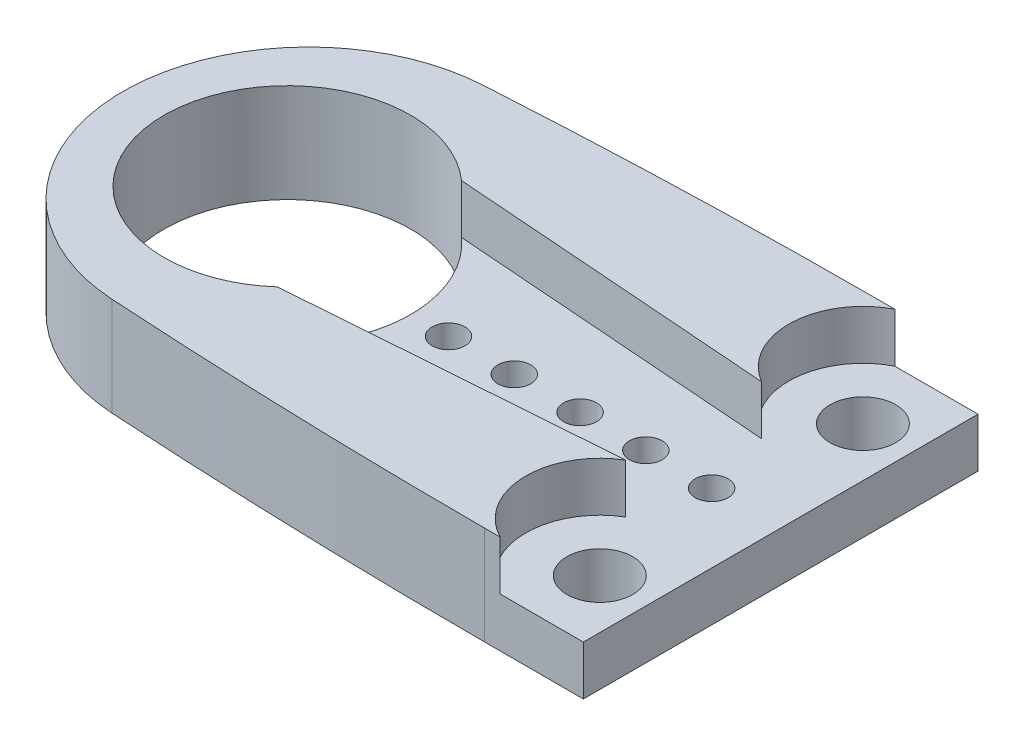
ISO-10303-21;
HEADER;
FILE_DESCRIPTION(('STEP AP214'),'2;1');
FILE_NAME('part.step','',(''),(''),'','','');
FILE_SCHEMA(('AUTOMOTIVE_DESIGN { 1 0 10303 214 1 1 1 1 }'));
ENDSEC;
DATA;
#1=APPLICATION_CONTEXT('core data for automotive mechanical design processes');
#2=APPLICATION_PROTOCOL_DEFINITION('international standard','automotive_design',2000,#1);
#3=PRODUCT_CONTEXT('',#1,'mechanical');
#4=PRODUCT('Part','Part','',(#3));
#5=PRODUCT_RELATED_PRODUCT_CATEGORY('part','',(#4));
#6=PRODUCT_DEFINITION_FORMATION('','',#4);
#7=PRODUCT_DEFINITION_CONTEXT('part definition',#1,'design');
#8=PRODUCT_DEFINITION('design','',#6,#7);
#9=PRODUCT_DEFINITION_SHAPE('','',#8);
#10=(LENGTH_UNIT() NAMED_UNIT(*) SI_UNIT(.MILLI.,.METRE.));
#11=(NAMED_UNIT(*) PLANE_ANGLE_UNIT() SI_UNIT($,.RADIAN.));
#12=(NAMED_UNIT(*) SI_UNIT($,.STERADIAN.) SOLID_ANGLE_UNIT());
#13=UNCERTAINTY_MEASURE_WITH_UNIT(LENGTH_MEASURE(1.E-05),#10,'distance_accuracy_value','');
#14=(GEOMETRIC_REPRESENTATION_CONTEXT(3) GLOBAL_UNCERTAINTY_ASSIGNED_CONTEXT((#13)) GLOBAL_UNIT_ASSIGNED_CONTEXT((#10,
#11,#12)) REPRESENTATION_CONTEXT('',''));
#15=CARTESIAN_POINT('',(0.,0.,0.));
#16=DIRECTION('',(0.,0.,1.));
#17=DIRECTION('',(1.,0.,0.));
#18=AXIS2_PLACEMENT_3D('',#15,#16,#17);
#19=CARTESIAN_POINT('',(14.9999999999997,-3.,-8.30498864123908E-13));
#20=DIRECTION('',(-1.,0.,0.));
#21=DIRECTION('',(0.,0.,1.));
#22=AXIS2_PLACEMENT_3D('',#19,#20,#21);
#23=PLANE('',#22);
#24=DIRECTION('',(0.,0.,-1.));
#25=VECTOR('',#24,1.);
#26=CARTESIAN_POINT('',(14.9999999999997,-1.5,-8.30498864123908E-13));
#27=LINE('',#26,#25);
#28=CARTESIAN_POINT('',(15.,-1.5,5.99999999999978));
#29=VERTEX_POINT('',#28);
#30=CARTESIAN_POINT('',(14.9999999999993,-1.5,-5.99999999999978));
#31=VERTEX_POINT('',#30);
#32=EDGE_CURVE('E163',#29,#31,#27,.T.);
#33=ORIENTED_EDGE('',*,*,#32,.F.);
#34=DIRECTION('',(0.,1.,0.));
#35=VECTOR('',#34,1.);
#36=CARTESIAN_POINT('',(15.,-3.,5.99999999999978));
#37=LINE('',#36,#35);
#38=CARTESIAN_POINT('',(15.,-3.,5.99999999999978));
#39=VERTEX_POINT('',#38);
#40=EDGE_CURVE('E235',#39,#29,#37,.T.);
#41=ORIENTED_EDGE('',*,*,#40,.F.);
#42=DIRECTION('',(0.,0.,1.));
#43=VECTOR('',#42,1.);
#44=CARTESIAN_POINT('',(14.9999999999997,-3.,-8.30498864123908E-13));
#45=LINE('',#44,#43);
#46=CARTESIAN_POINT('',(14.9999999999993,-3.,-5.99999999999978));
#47=VERTEX_POINT('',#46);
#48=EDGE_CURVE('E326',#47,#39,#45,.T.);
#49=ORIENTED_EDGE('',*,*,#48,.F.);
#50=DIRECTION('',(0.,1.,0.));
#51=VECTOR('',#50,1.);
#52=CARTESIAN_POINT('',(14.9999999999993,-3.,-5.99999999999978));
#53=LINE('',#52,#51);
#54=EDGE_CURVE('E239',#47,#31,#53,.T.);
#55=ORIENTED_EDGE('',*,*,#54,.T.);
#56=EDGE_LOOP('',(#33,#41,#49,#55));
#57=FACE_BOUND('',#56,.T.);
#58=ADVANCED_FACE('F35',(#57),#23,.F.);
#59=CARTESIAN_POINT('',(13.5,-3.,-4.));
#60=DIRECTION('',(0.,1.,0.));
#61=DIRECTION('',(0.,0.,1.));
#62=AXIS2_PLACEMENT_3D('',#59,#60,#61);
#63=CYLINDRICAL_SURFACE('',#62,1.00000000000001);
#64=CARTESIAN_POINT('',(13.5,-3.,-4.));
#65=DIRECTION('',(0.,1.,0.));
#66=DIRECTION('',(0.,0.,1.));
#67=AXIS2_PLACEMENT_3D('',#64,#65,#66);
#68=CIRCLE('',#67,1.00000000000001);
#69=CARTESIAN_POINT('',(13.5,-3.,-2.99999999999999));
#70=VERTEX_POINT('',#69);
#71=EDGE_CURVE('E255',#70,#70,#68,.T.);
#72=ORIENTED_EDGE('',*,*,#71,.F.);
#73=EDGE_LOOP('',(#72));
#74=FACE_BOUND('',#73,.T.);
#75=CARTESIAN_POINT('',(13.5,-1.5,-4.));
#76=DIRECTION('',(0.,1.,0.));
#77=DIRECTION('',(0.,0.,1.));
#78=AXIS2_PLACEMENT_3D('',#75,#76,#77);
#79=CIRCLE('',#78,1.00000000000001);
#80=CARTESIAN_POINT('',(13.5,-1.5,-2.99999999999999));
#81=VERTEX_POINT('',#80);
#82=EDGE_CURVE('E219',#81,#81,#79,.F.);
#83=ORIENTED_EDGE('',*,*,#82,.F.);
#84=EDGE_LOOP('',(#83));
#85=FACE_BOUND('',#84,.T.);
#86=ADVANCED_FACE('F293',(#74,#85),#63,.F.);
#87=CARTESIAN_POINT('',(13.5,-3.,4.));
#88=DIRECTION('',(0.,1.,0.));
#89=DIRECTION('',(0.,0.,1.));
#90=AXIS2_PLACEMENT_3D('',#87,#88,#89);
#91=CYLINDRICAL_SURFACE('',#90,1.00000000000001);
#92=CARTESIAN_POINT('',(13.5,-3.,4.));
#93=DIRECTION('',(0.,1.,0.));
#94=DIRECTION('',(0.,0.,1.));
#95=AXIS2_PLACEMENT_3D('',#92,#93,#94);
#96=CIRCLE('',#95,1.00000000000001);
#97=CARTESIAN_POINT('',(13.5,-3.,5.00000000000001));
#98=VERTEX_POINT('',#97);
#99=EDGE_CURVE('E249',#98,#98,#96,.F.);
#100=ORIENTED_EDGE('',*,*,#99,.T.);
#101=EDGE_LOOP('',(#100));
#102=FACE_BOUND('',#101,.T.);
#103=CARTESIAN_POINT('',(13.5,-1.5,4.));
#104=DIRECTION('',(0.,1.,0.));
#105=DIRECTION('',(0.,0.,1.));
#106=AXIS2_PLACEMENT_3D('',#103,#104,#105);
#107=CIRCLE('',#106,1.00000000000001);
#108=CARTESIAN_POINT('',(13.5,-1.5,5.00000000000001));
#109=VERTEX_POINT('',#108);
#110=EDGE_CURVE('E222',#109,#109,#107,.T.);
#111=ORIENTED_EDGE('',*,*,#110,.T.);
#112=EDGE_LOOP('',(#111));
#113=FACE_BOUND('',#112,.T.);
#114=ADVANCED_FACE('F287',(#102,#113),#91,.F.);
#115=CARTESIAN_POINT('',(12.,-3.,183.371748052205));
#116=DIRECTION('',(0.,1.,0.));
#117=DIRECTION('',(0.,0.,1.));
#118=AXIS2_PLACEMENT_3D('',#115,#116,#117);
#119=CYLINDRICAL_SURFACE('',#118,189.371748052205);
#120=CARTESIAN_POINT('',(12.,0.,183.371748052205));
#121=DIRECTION('',(0.,1.,0.));
#122=DIRECTION('',(0.,0.,1.));
#123=AXIS2_PLACEMENT_3D('',#120,#121,#122);
#124=CIRCLE('',#123,189.371748052205);
#125=CARTESIAN_POINT('',(12.,0.,-5.99999999999982));
#126=VERTEX_POINT('',#125);
#127=CARTESIAN_POINT('',(0.300000000000068,0.,-5.63822247937243));
#128=VERTEX_POINT('',#127);
#129=EDGE_CURVE('E264',#126,#128,#124,.T.);
#130=ORIENTED_EDGE('',*,*,#129,.F.);
#131=DIRECTION('',(0.,1.,0.));
#132=VECTOR('',#131,1.);
#133=CARTESIAN_POINT('',(12.,-3.,-5.99999999999982));
#134=LINE('',#133,#132);
#135=CARTESIAN_POINT('',(12.,-3.,-5.99999999999982));
#136=VERTEX_POINT('',#135);
#137=EDGE_CURVE('E135',#136,#126,#134,.T.);
#138=ORIENTED_EDGE('',*,*,#137,.F.);
#139=CARTESIAN_POINT('',(12.,-3.,183.371748052205));
#140=DIRECTION('',(0.,1.,0.));
#141=DIRECTION('',(0.,0.,1.));
#142=AXIS2_PLACEMENT_3D('',#139,#140,#141);
#143=CIRCLE('',#142,189.371748052205);
#144=CARTESIAN_POINT('',(0.300000000000068,-3.,-5.63822247937243));
#145=VERTEX_POINT('',#144);
#146=EDGE_CURVE('E276',#136,#145,#143,.T.);
#147=ORIENTED_EDGE('',*,*,#146,.T.);
#148=DIRECTION('',(0.,1.,0.));
#149=VECTOR('',#148,1.);
#150=CARTESIAN_POINT('',(0.300000000000068,-3.,-5.63822247937243));
#151=LINE('',#150,#149);
#152=EDGE_CURVE('E248',#145,#128,#151,.T.);
#153=ORIENTED_EDGE('',*,*,#152,.T.);
#154=EDGE_LOOP('',(#130,#138,#147,#153));
#155=FACE_BOUND('',#154,.T.);
#156=ADVANCED_FACE('F37',(#155),#119,.T.);
#157=CARTESIAN_POINT('',(0.,-3.,-5.99999999999995));
#158=DIRECTION('',(0.,0.,1.));
#159=DIRECTION('',(1.,0.,0.));
#160=AXIS2_PLACEMENT_3D('',#157,#158,#159);
#161=PLANE('',#160);
#162=DIRECTION('',(1.,0.,0.));
#163=VECTOR('',#162,1.);
#164=CARTESIAN_POINT('',(0.,0.,-5.99999999999995));
#165=LINE('',#164,#163);
#166=CARTESIAN_POINT('',(12.4692235935952,0.,-5.99999999999981));
#167=VERTEX_POINT('',#166);
#168=EDGE_CURVE('E274',#126,#167,#165,.T.);
#169=ORIENTED_EDGE('',*,*,#168,.T.);
#170=DIRECTION('',(0.,1.,0.));
#171=VECTOR('',#170,1.);
#172=CARTESIAN_POINT('',(12.4692235935952,-1.5,-5.99999999999981));
#173=LINE('',#172,#171);
#174=CARTESIAN_POINT('',(12.4692235935952,-1.5,-5.99999999999981));
#175=VERTEX_POINT('',#174);
#176=EDGE_CURVE('E207',#167,#175,#173,.F.);
#177=ORIENTED_EDGE('',*,*,#176,.T.);
#178=DIRECTION('',(-1.,0.,0.));
#179=VECTOR('',#178,1.);
#180=CARTESIAN_POINT('',(0.,-1.5,-5.99999999999995));
#181=LINE('',#180,#179);
#182=EDGE_CURVE('E214',#31,#175,#181,.T.);
#183=ORIENTED_EDGE('',*,*,#182,.F.);
#184=ORIENTED_EDGE('',*,*,#54,.F.);
#185=DIRECTION('',(1.,0.,0.));
#186=VECTOR('',#185,1.);
#187=CARTESIAN_POINT('',(0.,-3.,-5.99999999999995));
#188=LINE('',#187,#186);
#189=EDGE_CURVE('E260',#136,#47,#188,.T.);
#190=ORIENTED_EDGE('',*,*,#189,.F.);
#191=ORIENTED_EDGE('',*,*,#137,.T.);
#192=EDGE_LOOP('',(#169,#177,#183,#184,#190,#191));
#193=FACE_BOUND('',#192,.T.);
#194=ADVANCED_FACE('F280',(#193),#161,.F.);
#195=CARTESIAN_POINT('',(0.,-3.,5.99999999999995));
#196=DIRECTION('',(0.,0.,1.));
#197=DIRECTION('',(1.,0.,0.));
#198=AXIS2_PLACEMENT_3D('',#195,#196,#197);
#199=PLANE('',#198);
#200=DIRECTION('',(0.,1.,0.));
#201=VECTOR('',#200,1.);
#202=CARTESIAN_POINT('',(12.4692235935952,-1.5,5.99999999999981));
#203=LINE('',#202,#201);
#204=CARTESIAN_POINT('',(12.4692235935952,0.,5.99999999999981));
#205=VERTEX_POINT('',#204);
#206=CARTESIAN_POINT('',(12.4692235935952,-1.5,5.99999999999981));
#207=VERTEX_POINT('',#206);
#208=EDGE_CURVE('E212',#205,#207,#203,.F.);
#209=ORIENTED_EDGE('',*,*,#208,.F.);
#210=DIRECTION('',(1.,0.,0.));
#211=VECTOR('',#210,1.);
#212=CARTESIAN_POINT('',(0.,0.,5.99999999999995));
#213=LINE('',#212,#211);
#214=CARTESIAN_POINT('',(11.9999999999993,0.,5.99999999999982));
#215=VERTEX_POINT('',#214);
#216=EDGE_CURVE('E144',#215,#205,#213,.T.);
#217=ORIENTED_EDGE('',*,*,#216,.F.);
#218=DIRECTION('',(0.,1.,0.));
#219=VECTOR('',#218,1.);
#220=CARTESIAN_POINT('',(11.9999999999993,-3.,5.99999999999982));
#221=LINE('',#220,#219);
#222=CARTESIAN_POINT('',(11.9999999999993,-3.,5.99999999999982));
#223=VERTEX_POINT('',#222);
#224=EDGE_CURVE('E240',#223,#215,#221,.T.);
#225=ORIENTED_EDGE('',*,*,#224,.F.);
#226=DIRECTION('',(1.,0.,0.));
#227=VECTOR('',#226,1.);
#228=CARTESIAN_POINT('',(0.,-3.,5.99999999999995));
#229=LINE('',#228,#227);
#230=EDGE_CURVE('E237',#223,#39,#229,.T.);
#231=ORIENTED_EDGE('',*,*,#230,.T.);
#232=ORIENTED_EDGE('',*,*,#40,.T.);
#233=DIRECTION('',(-1.,0.,0.));
#234=VECTOR('',#233,1.);
#235=CARTESIAN_POINT('',(0.,-1.5,5.99999999999995));
#236=LINE('',#235,#234);
#237=EDGE_CURVE('E216',#29,#207,#236,.T.);
#238=ORIENTED_EDGE('',*,*,#237,.T.);
#239=EDGE_LOOP('',(#209,#217,#225,#231,#232,#238));
#240=FACE_BOUND('',#239,.T.);
#241=ADVANCED_FACE('F232',(#240),#199,.T.);
#242=CARTESIAN_POINT('',(12.,-3.,-183.371748052205));
#243=DIRECTION('',(0.,1.,0.));
#244=DIRECTION('',(0.,0.,1.));
#245=AXIS2_PLACEMENT_3D('',#242,#243,#244);
#246=CYLINDRICAL_SURFACE('',#245,189.371748052205);
#247=CARTESIAN_POINT('',(12.,0.,-183.371748052205));
#248=DIRECTION('',(0.,1.,0.));
#249=DIRECTION('',(0.,0.,1.));
#250=AXIS2_PLACEMENT_3D('',#247,#248,#249);
#251=CIRCLE('',#250,189.371748052205);
#252=CARTESIAN_POINT('',(0.300000000000069,0.,5.6382224793724));
#253=VERTEX_POINT('',#252);
#254=EDGE_CURVE('E270',#215,#253,#251,.F.);
#255=ORIENTED_EDGE('',*,*,#254,.T.);
#256=DIRECTION('',(0.,1.,0.));
#257=VECTOR('',#256,1.);
#258=CARTESIAN_POINT('',(0.300000000000069,-3.,5.6382224793724));
#259=LINE('',#258,#257);
#260=CARTESIAN_POINT('',(0.300000000000069,-3.,5.6382224793724));
#261=VERTEX_POINT('',#260);
#262=EDGE_CURVE('E244',#261,#253,#259,.T.);
#263=ORIENTED_EDGE('',*,*,#262,.F.);
#264=CARTESIAN_POINT('',(12.,-3.,-183.371748052205));
#265=DIRECTION('',(0.,1.,0.));
#266=DIRECTION('',(0.,0.,1.));
#267=AXIS2_PLACEMENT_3D('',#264,#265,#266);
#268=CIRCLE('',#267,189.371748052205);
#269=EDGE_CURVE('E321',#223,#261,#268,.F.);
#270=ORIENTED_EDGE('',*,*,#269,.F.);
#271=ORIENTED_EDGE('',*,*,#224,.T.);
#272=EDGE_LOOP('',(#255,#263,#270,#271));
#273=FACE_BOUND('',#272,.T.);
#274=ADVANCED_FACE('F305',(#273),#246,.T.);
#275=CARTESIAN_POINT('',(0.649014408198268,-3.,0.));
#276=DIRECTION('',(0.,1.,0.));
#277=DIRECTION('',(0.,0.,1.));
#278=AXIS2_PLACEMENT_3D('',#275,#276,#277);
#279=CYLINDRICAL_SURFACE('',#278,5.64901440819827);
#280=CARTESIAN_POINT('',(0.649014408198268,0.,0.));
#281=DIRECTION('',(0.,1.,0.));
#282=DIRECTION('',(0.,0.,1.));
#283=AXIS2_PLACEMENT_3D('',#280,#281,#282);
#284=CIRCLE('',#283,5.64901440819827);
#285=EDGE_CURVE('E267',#128,#253,#284,.T.);
#286=ORIENTED_EDGE('',*,*,#285,.F.);
#287=ORIENTED_EDGE('',*,*,#152,.F.);
#288=CARTESIAN_POINT('',(0.649014408198268,-3.,0.));
#289=DIRECTION('',(0.,1.,0.));
#290=DIRECTION('',(0.,0.,1.));
#291=AXIS2_PLACEMENT_3D('',#288,#289,#290);
#292=CIRCLE('',#291,5.64901440819827);
#293=EDGE_CURVE('E323',#145,#261,#292,.T.);
#294=ORIENTED_EDGE('',*,*,#293,.T.);
#295=ORIENTED_EDGE('',*,*,#262,.T.);
#296=EDGE_LOOP('',(#286,#287,#294,#295));
#297=FACE_BOUND('',#296,.T.);
#298=ADVANCED_FACE('F307',(#297),#279,.T.);
#299=CARTESIAN_POINT('',(0.,-3.,0.));
#300=DIRECTION('',(0.,1.,0.));
#301=DIRECTION('',(0.,0.,1.));
#302=AXIS2_PLACEMENT_3D('',#299,#300,#301);
#303=PLANE('',#302);
#304=CARTESIAN_POINT('',(12.9,-3.,0.));
#305=DIRECTION('',(0.,1.,0.));
#306=DIRECTION('',(0.,0.,1.));
#307=AXIS2_PLACEMENT_3D('',#304,#305,#306);
#308=CIRCLE('',#307,0.5);
#309=CARTESIAN_POINT('',(12.9,-3.,0.500000000000005));
#310=VERTEX_POINT('',#309);
#311=EDGE_CURVE('E201',#310,#310,#308,.T.);
#312=ORIENTED_EDGE('',*,*,#311,.T.);
#313=EDGE_LOOP('',(#312));
#314=FACE_BOUND('',#313,.T.);
#315=CARTESIAN_POINT('',(10.9,-3.,0.));
#316=DIRECTION('',(0.,1.,0.));
#317=DIRECTION('',(0.,0.,1.));
#318=AXIS2_PLACEMENT_3D('',#315,#316,#317);
#319=CIRCLE('',#318,0.5);
#320=CARTESIAN_POINT('',(10.9,-3.,0.500000000000004));
#321=VERTEX_POINT('',#320);
#322=EDGE_CURVE('E195',#321,#321,#319,.T.);
#323=ORIENTED_EDGE('',*,*,#322,.T.);
#324=EDGE_LOOP('',(#323));
#325=FACE_BOUND('',#324,.T.);
#326=CARTESIAN_POINT('',(8.9,-3.,0.));
#327=DIRECTION('',(0.,1.,0.));
#328=DIRECTION('',(0.,0.,1.));
#329=AXIS2_PLACEMENT_3D('',#326,#327,#328);
#330=CIRCLE('',#329,0.5);
#331=CARTESIAN_POINT('',(8.9,-3.,0.500000000000004));
#332=VERTEX_POINT('',#331);
#333=EDGE_CURVE('E189',#332,#332,#330,.T.);
#334=ORIENTED_EDGE('',*,*,#333,.T.);
#335=EDGE_LOOP('',(#334));
#336=FACE_BOUND('',#335,.T.);
#337=CARTESIAN_POINT('',(6.9,-3.,0.));
#338=DIRECTION('',(0.,1.,0.));
#339=DIRECTION('',(0.,0.,1.));
#340=AXIS2_PLACEMENT_3D('',#337,#338,#339);
#341=CIRCLE('',#340,0.5);
#342=CARTESIAN_POINT('',(6.9,-3.,0.500000000000004));
#343=VERTEX_POINT('',#342);
#344=EDGE_CURVE('E183',#343,#343,#341,.T.);
#345=ORIENTED_EDGE('',*,*,#344,.T.);
#346=EDGE_LOOP('',(#345));
#347=FACE_BOUND('',#346,.T.);
#348=CARTESIAN_POINT('',(4.9,-3.,0.));
#349=DIRECTION('',(0.,1.,0.));
#350=DIRECTION('',(0.,0.,1.));
#351=AXIS2_PLACEMENT_3D('',#348,#349,#350);
#352=CIRCLE('',#351,0.5);
#353=CARTESIAN_POINT('',(4.9,-3.,0.500000000000004));
#354=VERTEX_POINT('',#353);
#355=EDGE_CURVE('E177',#354,#354,#352,.T.);
#356=ORIENTED_EDGE('',*,*,#355,.T.);
#357=EDGE_LOOP('',(#356));
#358=FACE_BOUND('',#357,.T.);
#359=CARTESIAN_POINT('',(0.,-3.,0.));
#360=DIRECTION('',(0.,1.,0.));
#361=DIRECTION('',(0.,0.,1.));
#362=AXIS2_PLACEMENT_3D('',#359,#360,#361);
#363=CIRCLE('',#362,3.75);
#364=CARTESIAN_POINT('',(0.,-3.,3.75));
#365=VERTEX_POINT('',#364);
#366=EDGE_CURVE('E153',#365,#365,#363,.T.);
#367=ORIENTED_EDGE('',*,*,#366,.T.);
#368=EDGE_LOOP('',(#367));
#369=FACE_BOUND('',#368,.T.);
#370=ORIENTED_EDGE('',*,*,#146,.F.);
#371=ORIENTED_EDGE('',*,*,#189,.T.);
#372=ORIENTED_EDGE('',*,*,#48,.T.);
#373=ORIENTED_EDGE('',*,*,#230,.F.);
#374=ORIENTED_EDGE('',*,*,#269,.T.);
#375=ORIENTED_EDGE('',*,*,#293,.F.);
#376=EDGE_LOOP('',(#370,#371,#372,#373,#374,#375));
#377=FACE_BOUND('',#376,.T.);
#378=ORIENTED_EDGE('',*,*,#71,.T.);
#379=EDGE_LOOP('',(#378));
#380=FACE_BOUND('',#379,.T.);
#381=ORIENTED_EDGE('',*,*,#99,.F.);
#382=EDGE_LOOP('',(#381));
#383=FACE_BOUND('',#382,.T.);
#384=ADVANCED_FACE('F310',(#314,#325,#336,#347,#358,#369,#377,#380,#383),#303,.F.);
#385=CARTESIAN_POINT('',(0.,0.,0.));
#386=DIRECTION('',(0.,1.,0.));
#387=DIRECTION('',(0.,0.,1.));
#388=AXIS2_PLACEMENT_3D('',#385,#386,#387);
#389=PLANE('',#388);
#390=CARTESIAN_POINT('',(13.5,0.,4.));
#391=DIRECTION('',(0.,1.,0.));
#392=DIRECTION('',(0.,0.,1.));
#393=AXIS2_PLACEMENT_3D('',#390,#391,#392);
#394=CIRCLE('',#393,2.25);
#395=CARTESIAN_POINT('',(12.3518379126558,0.,2.06500030460326));
#396=VERTEX_POINT('',#395);
#397=EDGE_CURVE('E127',#396,#205,#394,.T.);
#398=ORIENTED_EDGE('',*,*,#397,.F.);
#399=DIRECTION('',(0.997231667992043,0.,-0.0743572481591925));
#400=VECTOR('',#399,1.);
#401=CARTESIAN_POINT('',(2.49449393665328,0.,2.8));
#402=LINE('',#401,#400);
#403=CARTESIAN_POINT('',(2.49449393665328,0.,2.8));
#404=VERTEX_POINT('',#403);
#405=EDGE_CURVE('E141',#404,#396,#402,.T.);
#406=ORIENTED_EDGE('',*,*,#405,.F.);
#407=CARTESIAN_POINT('',(0.,0.,0.));
#408=DIRECTION('',(0.,1.,0.));
#409=DIRECTION('',(0.,0.,1.));
#410=AXIS2_PLACEMENT_3D('',#407,#408,#409);
#411=CIRCLE('',#410,3.75);
#412=CARTESIAN_POINT('',(2.49449393665328,0.,-2.8));
#413=VERTEX_POINT('',#412);
#414=EDGE_CURVE('E58',#413,#404,#411,.T.);
#415=ORIENTED_EDGE('',*,*,#414,.F.);
#416=DIRECTION('',(-0.997231667992043,0.,-0.0743572481591926));
#417=VECTOR('',#416,1.);
#418=CARTESIAN_POINT('',(14.1314068018781,0.,-1.93230912585366));
#419=LINE('',#418,#417);
#420=CARTESIAN_POINT('',(12.3518379126559,0.,-2.06500030460324));
#421=VERTEX_POINT('',#420);
#422=EDGE_CURVE('E149',#421,#413,#419,.T.);
#423=ORIENTED_EDGE('',*,*,#422,.F.);
#424=CARTESIAN_POINT('',(13.5,0.,-4.));
#425=DIRECTION('',(0.,1.,0.));
#426=DIRECTION('',(0.,0.,1.));
#427=AXIS2_PLACEMENT_3D('',#424,#425,#426);
#428=CIRCLE('',#427,2.25);
#429=EDGE_CURVE('E145',#167,#421,#428,.T.);
#430=ORIENTED_EDGE('',*,*,#429,.F.);
#431=ORIENTED_EDGE('',*,*,#168,.F.);
#432=ORIENTED_EDGE('',*,*,#129,.T.);
#433=ORIENTED_EDGE('',*,*,#285,.T.);
#434=ORIENTED_EDGE('',*,*,#254,.F.);
#435=ORIENTED_EDGE('',*,*,#216,.T.);
#436=EDGE_LOOP('',(#398,#406,#415,#423,#430,#431,#432,#433,#434,#435));
#437=FACE_BOUND('',#436,.T.);
#438=ADVANCED_FACE('F140',(#437),#389,.T.);
#439=CARTESIAN_POINT('',(0.,-1.5,0.));
#440=DIRECTION('',(0.,1.,0.));
#441=DIRECTION('',(0.,0.,1.));
#442=AXIS2_PLACEMENT_3D('',#439,#440,#441);
#443=PLANE('',#442);
#444=DIRECTION('',(0.997231667992043,0.,-0.0743572481591925));
#445=VECTOR('',#444,1.);
#446=CARTESIAN_POINT('',(2.49449393665328,-1.5,2.8));
#447=LINE('',#446,#445);
#448=CARTESIAN_POINT('',(2.49449393665327,-1.5,2.80000000000001));
#449=VERTEX_POINT('',#448);
#450=CARTESIAN_POINT('',(12.3518379126558,-1.5,2.06500030460326));
#451=VERTEX_POINT('',#450);
#452=EDGE_CURVE('E151',#449,#451,#447,.T.);
#453=ORIENTED_EDGE('',*,*,#452,.T.);
#454=CARTESIAN_POINT('',(13.5,-1.5,4.));
#455=DIRECTION('',(0.,1.,0.));
#456=DIRECTION('',(0.,0.,1.));
#457=AXIS2_PLACEMENT_3D('',#454,#455,#456);
#458=CIRCLE('',#457,2.25);
#459=EDGE_CURVE('E130',#451,#207,#458,.T.);
#460=ORIENTED_EDGE('',*,*,#459,.T.);
#461=ORIENTED_EDGE('',*,*,#237,.F.);
#462=ORIENTED_EDGE('',*,*,#32,.T.);
#463=ORIENTED_EDGE('',*,*,#182,.T.);
#464=CARTESIAN_POINT('',(13.5,-1.5,-4.));
#465=DIRECTION('',(0.,1.,0.));
#466=DIRECTION('',(0.,0.,1.));
#467=AXIS2_PLACEMENT_3D('',#464,#465,#466);
#468=CIRCLE('',#467,2.25);
#469=CARTESIAN_POINT('',(12.3518379126559,-1.5,-2.06500030460324));
#470=VERTEX_POINT('',#469);
#471=EDGE_CURVE('E50',#175,#470,#468,.T.);
#472=ORIENTED_EDGE('',*,*,#471,.T.);
#473=DIRECTION('',(-0.997231667992043,0.,-0.0743572481591926));
#474=VECTOR('',#473,1.);
#475=CARTESIAN_POINT('',(14.1314068018781,-1.5,-1.93230912585366));
#476=LINE('',#475,#474);
#477=CARTESIAN_POINT('',(2.49449393665328,-1.5,-2.8));
#478=VERTEX_POINT('',#477);
#479=EDGE_CURVE('E166',#470,#478,#476,.T.);
#480=ORIENTED_EDGE('',*,*,#479,.T.);
#481=CARTESIAN_POINT('',(0.,-1.5,0.));
#482=DIRECTION('',(0.,1.,0.));
#483=DIRECTION('',(0.,0.,1.));
#484=AXIS2_PLACEMENT_3D('',#481,#482,#483);
#485=CIRCLE('',#484,3.75);
#486=EDGE_CURVE('E175',#449,#478,#485,.T.);
#487=ORIENTED_EDGE('',*,*,#486,.F.);
#488=EDGE_LOOP('',(#453,#460,#461,#462,#463,#472,#480,#487));
#489=FACE_BOUND('',#488,.T.);
#490=CARTESIAN_POINT('',(12.9,-1.5,0.));
#491=DIRECTION('',(0.,1.,0.));
#492=DIRECTION('',(0.,0.,1.));
#493=AXIS2_PLACEMENT_3D('',#490,#491,#492);
#494=CIRCLE('',#493,0.5);
#495=CARTESIAN_POINT('',(12.9,-1.5,0.500000000000005));
#496=VERTEX_POINT('',#495);
#497=EDGE_CURVE('E204',#496,#496,#494,.T.);
#498=ORIENTED_EDGE('',*,*,#497,.F.);
#499=EDGE_LOOP('',(#498));
#500=FACE_BOUND('',#499,.T.);
#501=CARTESIAN_POINT('',(10.9,-1.5,0.));
#502=DIRECTION('',(0.,1.,0.));
#503=DIRECTION('',(0.,0.,1.));
#504=AXIS2_PLACEMENT_3D('',#501,#502,#503);
#505=CIRCLE('',#504,0.5);
#506=CARTESIAN_POINT('',(10.9,-1.5,0.500000000000004));
#507=VERTEX_POINT('',#506);
#508=EDGE_CURVE('E198',#507,#507,#505,.T.);
#509=ORIENTED_EDGE('',*,*,#508,.F.);
#510=EDGE_LOOP('',(#509));
#511=FACE_BOUND('',#510,.T.);
#512=CARTESIAN_POINT('',(8.9,-1.5,0.));
#513=DIRECTION('',(0.,1.,0.));
#514=DIRECTION('',(0.,0.,1.));
#515=AXIS2_PLACEMENT_3D('',#512,#513,#514);
#516=CIRCLE('',#515,0.5);
#517=CARTESIAN_POINT('',(8.9,-1.5,0.500000000000004));
#518=VERTEX_POINT('',#517);
#519=EDGE_CURVE('E192',#518,#518,#516,.T.);
#520=ORIENTED_EDGE('',*,*,#519,.F.);
#521=EDGE_LOOP('',(#520));
#522=FACE_BOUND('',#521,.T.);
#523=CARTESIAN_POINT('',(6.9,-1.5,0.));
#524=DIRECTION('',(0.,1.,0.));
#525=DIRECTION('',(0.,0.,1.));
#526=AXIS2_PLACEMENT_3D('',#523,#524,#525);
#527=CIRCLE('',#526,0.5);
#528=CARTESIAN_POINT('',(6.9,-1.5,0.500000000000004));
#529=VERTEX_POINT('',#528);
#530=EDGE_CURVE('E186',#529,#529,#527,.T.);
#531=ORIENTED_EDGE('',*,*,#530,.F.);
#532=EDGE_LOOP('',(#531));
#533=FACE_BOUND('',#532,.T.);
#534=CARTESIAN_POINT('',(4.9,-1.5,0.));
#535=DIRECTION('',(0.,1.,0.));
#536=DIRECTION('',(0.,0.,1.));
#537=AXIS2_PLACEMENT_3D('',#534,#535,#536);
#538=CIRCLE('',#537,0.5);
#539=CARTESIAN_POINT('',(4.9,-1.5,0.500000000000004));
#540=VERTEX_POINT('',#539);
#541=EDGE_CURVE('E180',#540,#540,#538,.T.);
#542=ORIENTED_EDGE('',*,*,#541,.F.);
#543=EDGE_LOOP('',(#542));
#544=FACE_BOUND('',#543,.T.);
#545=ORIENTED_EDGE('',*,*,#110,.F.);
#546=EDGE_LOOP('',(#545));
#547=FACE_BOUND('',#546,.T.);
#548=ORIENTED_EDGE('',*,*,#82,.T.);
#549=EDGE_LOOP('',(#548));
#550=FACE_BOUND('',#549,.T.);
#551=ADVANCED_FACE('F228',(#489,#500,#511,#522,#533,#544,#547,#550),#443,.T.);
#552=CARTESIAN_POINT('',(0.,-1.5,0.));
#553=DIRECTION('',(0.,1.,0.));
#554=DIRECTION('',(0.,0.,1.));
#555=AXIS2_PLACEMENT_3D('',#552,#553,#554);
#556=CYLINDRICAL_SURFACE('',#555,3.75);
#557=ORIENTED_EDGE('',*,*,#414,.T.);
#558=DIRECTION('',(0.,1.,0.));
#559=VECTOR('',#558,1.);
#560=CARTESIAN_POINT('',(2.49449393665328,-1.5,2.8));
#561=LINE('',#560,#559);
#562=EDGE_CURVE('E148',#449,#404,#561,.T.);
#563=ORIENTED_EDGE('',*,*,#562,.F.);
#564=ORIENTED_EDGE('',*,*,#486,.T.);
#565=DIRECTION('',(0.,1.,0.));
#566=VECTOR('',#565,1.);
#567=CARTESIAN_POINT('',(2.49449393665328,-1.5,-2.8));
#568=LINE('',#567,#566);
#569=EDGE_CURVE('E169',#478,#413,#568,.T.);
#570=ORIENTED_EDGE('',*,*,#569,.T.);
#571=EDGE_LOOP('',(#557,#563,#564,#570));
#572=FACE_BOUND('',#571,.T.);
#573=ORIENTED_EDGE('',*,*,#366,.F.);
#574=EDGE_LOOP('',(#573));
#575=FACE_BOUND('',#574,.T.);
#576=ADVANCED_FACE('F336',(#572,#575),#556,.F.);
#577=CARTESIAN_POINT('',(14.1314068018781,-1.5,-1.93230912585366));
#578=DIRECTION('',(0.0743572481591926,0.,-0.997231667992043));
#579=DIRECTION('',(-0.997231667992043,0.,-0.0743572481591926));
#580=AXIS2_PLACEMENT_3D('',#577,#578,#579);
#581=PLANE('',#580);
#582=ORIENTED_EDGE('',*,*,#479,.F.);
#583=DIRECTION('',(0.,1.,0.));
#584=VECTOR('',#583,1.);
#585=CARTESIAN_POINT('',(12.3518379126559,-1.5,-2.06500030460325));
#586=LINE('',#585,#584);
#587=EDGE_CURVE('E11',#470,#421,#586,.T.);
#588=ORIENTED_EDGE('',*,*,#587,.T.);
#589=ORIENTED_EDGE('',*,*,#422,.T.);
#590=ORIENTED_EDGE('',*,*,#569,.F.);
#591=EDGE_LOOP('',(#582,#588,#589,#590));
#592=FACE_BOUND('',#591,.T.);
#593=ADVANCED_FACE('F335',(#592),#581,.F.);
#594=CARTESIAN_POINT('',(2.49449393665328,-1.5,2.8));
#595=DIRECTION('',(0.0743572481591925,0.,0.997231667992043));
#596=DIRECTION('',(0.997231667992043,0.,-0.0743572481591925));
#597=AXIS2_PLACEMENT_3D('',#594,#595,#596);
#598=PLANE('',#597);
#599=ORIENTED_EDGE('',*,*,#405,.T.);
#600=DIRECTION('',(0.,1.,0.));
#601=VECTOR('',#600,1.);
#602=CARTESIAN_POINT('',(12.3518379126558,-1.5,2.06500030460326));
#603=LINE('',#602,#601);
#604=EDGE_CURVE('E43',#396,#451,#603,.F.);
#605=ORIENTED_EDGE('',*,*,#604,.T.);
#606=ORIENTED_EDGE('',*,*,#452,.F.);
#607=ORIENTED_EDGE('',*,*,#562,.T.);
#608=EDGE_LOOP('',(#599,#605,#606,#607));
#609=FACE_BOUND('',#608,.T.);
#610=ADVANCED_FACE('F147',(#609),#598,.F.);
#611=CARTESIAN_POINT('',(4.9,-3.,0.));
#612=DIRECTION('',(0.,1.,0.));
#613=DIRECTION('',(0.,0.,1.));
#614=AXIS2_PLACEMENT_3D('',#611,#612,#613);
#615=CYLINDRICAL_SURFACE('',#614,0.5);
#616=ORIENTED_EDGE('',*,*,#355,.F.);
#617=EDGE_LOOP('',(#616));
#618=FACE_BOUND('',#617,.T.);
#619=ORIENTED_EDGE('',*,*,#541,.T.);
#620=EDGE_LOOP('',(#619));
#621=FACE_BOUND('',#620,.T.);
#622=ADVANCED_FACE('F378',(#618,#621),#615,.F.);
#623=CARTESIAN_POINT('',(6.9,-3.,0.));
#624=DIRECTION('',(0.,1.,0.));
#625=DIRECTION('',(0.,0.,1.));
#626=AXIS2_PLACEMENT_3D('',#623,#624,#625);
#627=CYLINDRICAL_SURFACE('',#626,0.5);
#628=ORIENTED_EDGE('',*,*,#344,.F.);
#629=EDGE_LOOP('',(#628));
#630=FACE_BOUND('',#629,.T.);
#631=ORIENTED_EDGE('',*,*,#530,.T.);
#632=EDGE_LOOP('',(#631));
#633=FACE_BOUND('',#632,.T.);
#634=ADVANCED_FACE('F410',(#630,#633),#627,.F.);
#635=CARTESIAN_POINT('',(8.9,-3.,0.));
#636=DIRECTION('',(0.,1.,0.));
#637=DIRECTION('',(0.,0.,1.));
#638=AXIS2_PLACEMENT_3D('',#635,#636,#637);
#639=CYLINDRICAL_SURFACE('',#638,0.5);
#640=ORIENTED_EDGE('',*,*,#333,.F.);
#641=EDGE_LOOP('',(#640));
#642=FACE_BOUND('',#641,.T.);
#643=ORIENTED_EDGE('',*,*,#519,.T.);
#644=EDGE_LOOP('',(#643));
#645=FACE_BOUND('',#644,.T.);
#646=ADVANCED_FACE('F406',(#642,#645),#639,.F.);
#647=CARTESIAN_POINT('',(10.9,-3.,0.));
#648=DIRECTION('',(0.,1.,0.));
#649=DIRECTION('',(0.,0.,1.));
#650=AXIS2_PLACEMENT_3D('',#647,#648,#649);
#651=CYLINDRICAL_SURFACE('',#650,0.5);
#652=ORIENTED_EDGE('',*,*,#322,.F.);
#653=EDGE_LOOP('',(#652));
#654=FACE_BOUND('',#653,.T.);
#655=ORIENTED_EDGE('',*,*,#508,.T.);
#656=EDGE_LOOP('',(#655));
#657=FACE_BOUND('',#656,.T.);
#658=ADVANCED_FACE('F402',(#654,#657),#651,.F.);
#659=CARTESIAN_POINT('',(12.9,-3.,0.));
#660=DIRECTION('',(0.,1.,0.));
#661=DIRECTION('',(0.,0.,1.));
#662=AXIS2_PLACEMENT_3D('',#659,#660,#661);
#663=CYLINDRICAL_SURFACE('',#662,0.5);
#664=ORIENTED_EDGE('',*,*,#311,.F.);
#665=EDGE_LOOP('',(#664));
#666=FACE_BOUND('',#665,.T.);
#667=ORIENTED_EDGE('',*,*,#497,.T.);
#668=EDGE_LOOP('',(#667));
#669=FACE_BOUND('',#668,.T.);
#670=ADVANCED_FACE('F387',(#666,#669),#663,.F.);
#671=CARTESIAN_POINT('',(13.5,-1.5,4.));
#672=DIRECTION('',(0.,1.,0.));
#673=DIRECTION('',(0.,0.,1.));
#674=AXIS2_PLACEMENT_3D('',#671,#672,#673);
#675=CYLINDRICAL_SURFACE('',#674,2.25);
#676=ORIENTED_EDGE('',*,*,#208,.T.);
#677=ORIENTED_EDGE('',*,*,#459,.F.);
#678=ORIENTED_EDGE('',*,*,#604,.F.);
#679=ORIENTED_EDGE('',*,*,#397,.T.);
#680=EDGE_LOOP('',(#676,#677,#678,#679));
#681=FACE_BOUND('',#680,.T.);
#682=ADVANCED_FACE('F126',(#681),#675,.F.);
#683=CARTESIAN_POINT('',(13.5,-1.5,-4.));
#684=DIRECTION('',(0.,1.,0.));
#685=DIRECTION('',(0.,0.,1.));
#686=AXIS2_PLACEMENT_3D('',#683,#684,#685);
#687=CYLINDRICAL_SURFACE('',#686,2.25);
#688=ORIENTED_EDGE('',*,*,#429,.T.);
#689=ORIENTED_EDGE('',*,*,#587,.F.);
#690=ORIENTED_EDGE('',*,*,#471,.F.);
#691=ORIENTED_EDGE('',*,*,#176,.F.);
#692=EDGE_LOOP('',(#688,#689,#690,#691));
#693=FACE_BOUND('',#692,.T.);
#694=ADVANCED_FACE('F332',(#693),#687,.F.);
#695=CLOSED_SHELL('',(#58,#86,#114,#156,#194,#241,#274,#298,#384,#438,#551,#576,#593,#610,#622,
#634,#646,#658,#670,#682,#694));
#696=MANIFOLD_SOLID_BREP('B2',#695);
#697=ADVANCED_BREP_SHAPE_REPRESENTATION('',(#18,#696),#14);
#698=SHAPE_DEFINITION_REPRESENTATION(#9,#697);
ENDSEC;
END-ISO-10303-21;
